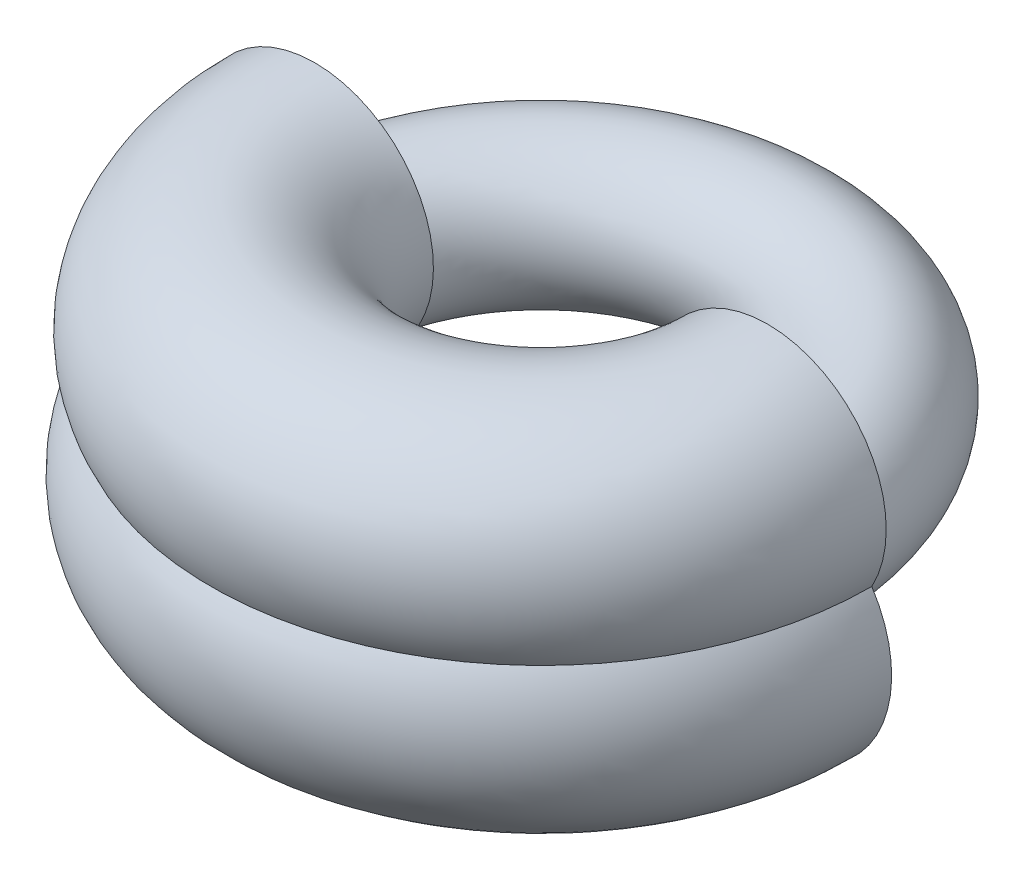
ISO-10303-21;
HEADER;
FILE_DESCRIPTION(('STEP AP214'),'2;1');
FILE_NAME('part.step','',(''),(''),'','','');
FILE_SCHEMA(('AUTOMOTIVE_DESIGN { 1 0 10303 214 1 1 1 1 }'));
ENDSEC;
DATA;
#1=APPLICATION_CONTEXT('core data for automotive mechanical design processes');
#2=APPLICATION_PROTOCOL_DEFINITION('international standard','automotive_design',2000,#1);
#3=PRODUCT_CONTEXT('',#1,'mechanical');
#4=PRODUCT('Part','Part','',(#3));
#5=PRODUCT_RELATED_PRODUCT_CATEGORY('part','',(#4));
#6=PRODUCT_DEFINITION_FORMATION('','',#4);
#7=PRODUCT_DEFINITION_CONTEXT('part definition',#1,'design');
#8=PRODUCT_DEFINITION('design','',#6,#7);
#9=PRODUCT_DEFINITION_SHAPE('','',#8);
#10=(LENGTH_UNIT() NAMED_UNIT(*) SI_UNIT(.MILLI.,.METRE.));
#11=(NAMED_UNIT(*) PLANE_ANGLE_UNIT() SI_UNIT($,.RADIAN.));
#12=(NAMED_UNIT(*) SI_UNIT($,.STERADIAN.) SOLID_ANGLE_UNIT());
#13=UNCERTAINTY_MEASURE_WITH_UNIT(LENGTH_MEASURE(1.E-05),#10,'distance_accuracy_value','');
#14=(GEOMETRIC_REPRESENTATION_CONTEXT(3) GLOBAL_UNCERTAINTY_ASSIGNED_CONTEXT((#13)) GLOBAL_UNIT_ASSIGNED_CONTEXT((#10,
#11,#12)) REPRESENTATION_CONTEXT('',''));
#15=CARTESIAN_POINT('',(0.,0.,0.));
#16=DIRECTION('',(0.,0.,1.));
#17=DIRECTION('',(1.,0.,0.));
#18=AXIS2_PLACEMENT_3D('',#15,#16,#17);
#19=CARTESIAN_POINT('',(0.,29.034348048603,0.));
#20=DIRECTION('',(0.,1.,0.));
#21=DIRECTION('',(0.,0.,1.));
#22=AXIS2_PLACEMENT_3D('',#19,#20,#21);
#23=TOROIDAL_SURFACE('',#22,23.7825711692689,12.4486926690953);
#24=CARTESIAN_POINT('',(0.,23.0828795413032,0.));
#25=DIRECTION('',(0.,1.,0.));
#26=DIRECTION('',(0.,0.,1.));
#27=AXIS2_PLACEMENT_3D('',#24,#25,#26);
#28=CIRCLE('',#27,12.8486801977891);
#29=CARTESIAN_POINT('',(-12.8486801977891,23.0828795413032,0.));
#30=VERTEX_POINT('',#29);
#31=CARTESIAN_POINT('',(12.8486801977891,23.0828795413032,0.));
#32=VERTEX_POINT('',#31);
#33=EDGE_CURVE('E41',#30,#32,#28,.T.);
#34=ORIENTED_EDGE('',*,*,#33,.F.);
#35=CARTESIAN_POINT('',(-23.7825711692689,29.034348048603,-1.66072806854422E-13));
#36=DIRECTION('',(0.,0.,-1.));
#37=DIRECTION('',(-1.,0.,0.));
#38=AXIS2_PLACEMENT_3D('',#35,#36,#37);
#39=CIRCLE('',#38,12.4486926690953);
#40=CARTESIAN_POINT('',(-34.7164621407487,23.0828795413032,-2.42423759430157E-13));
#41=VERTEX_POINT('',#40);
#42=EDGE_CURVE('E69',#41,#30,#39,.T.);
#43=ORIENTED_EDGE('',*,*,#42,.F.);
#44=CARTESIAN_POINT('',(0.,23.0828795413032,0.));
#45=DIRECTION('',(0.,1.,0.));
#46=DIRECTION('',(0.,0.,1.));
#47=AXIS2_PLACEMENT_3D('',#44,#45,#46);
#48=CIRCLE('',#47,34.7164621407487);
#49=CARTESIAN_POINT('',(34.7164621407487,23.0828795413032,0.));
#50=VERTEX_POINT('',#49);
#51=EDGE_CURVE('E48',#41,#50,#48,.T.);
#52=ORIENTED_EDGE('',*,*,#51,.T.);
#53=CARTESIAN_POINT('',(23.7825711692689,29.034348048603,0.));
#54=DIRECTION('',(0.,0.,1.));
#55=DIRECTION('',(1.,0.,0.));
#56=AXIS2_PLACEMENT_3D('',#53,#54,#55);
#57=CIRCLE('',#56,12.4486926690953);
#58=EDGE_CURVE('E64',#50,#32,#57,.T.);
#59=ORIENTED_EDGE('',*,*,#58,.T.);
#60=EDGE_LOOP('',(#34,#43,#52,#59));
#61=FACE_BOUND('',#60,.T.);
#62=ADVANCED_FACE('F33',(#61),#23,.T.);
#63=CARTESIAN_POINT('',(0.,16.0148765534997,0.));
#64=DIRECTION('',(0.,1.,0.));
#65=DIRECTION('',(0.,0.,1.));
#66=AXIS2_PLACEMENT_3D('',#63,#64,#65);
#67=TOROIDAL_SURFACE('',#66,23.7825711692689,13.0194714951033);
#68=CARTESIAN_POINT('',(-23.7825711692689,16.0148765534997,-1.66072806854422E-13));
#69=DIRECTION('',(0.,0.,-1.));
#70=DIRECTION('',(-1.,0.,0.));
#71=AXIS2_PLACEMENT_3D('',#68,#69,#70);
#72=CIRCLE('',#71,13.0194714951033);
#73=EDGE_CURVE('E62',#30,#41,#72,.T.);
#74=ORIENTED_EDGE('',*,*,#73,.F.);
#75=ORIENTED_EDGE('',*,*,#33,.T.);
#76=CARTESIAN_POINT('',(23.7825711692689,16.0148765534997,0.));
#77=DIRECTION('',(0.,0.,1.));
#78=DIRECTION('',(1.,0.,0.));
#79=AXIS2_PLACEMENT_3D('',#76,#77,#78);
#80=CIRCLE('',#79,13.0194714951033);
#81=EDGE_CURVE('E60',#32,#50,#80,.T.);
#82=ORIENTED_EDGE('',*,*,#81,.T.);
#83=ORIENTED_EDGE('',*,*,#51,.F.);
#84=EDGE_LOOP('',(#74,#75,#82,#83));
#85=FACE_BOUND('',#84,.T.);
#86=ADVANCED_FACE('F35',(#85),#67,.T.);
#87=CARTESIAN_POINT('',(-23.7825711692689,22.5246123010513,-1.66072806854422E-13));
#88=DIRECTION('',(0.,0.,-1.));
#89=DIRECTION('',(-1.,0.,0.));
#90=AXIS2_PLACEMENT_3D('',#87,#88,#89);
#91=PLANE('',#90);
#92=CARTESIAN_POINT('',(-24.6676754944566,22.9927370912543,1.72253457323067E-13));
#93=DIRECTION('',(0.,0.,1.));
#94=DIRECTION('',(1.,0.,0.));
#95=AXIS2_PLACEMENT_3D('',#92,#93,#94);
#96=CIRCLE('',#95,7.79168692973486);
#97=CARTESIAN_POINT('',(-32.4593624241915,22.9927370912543,2.26662516349621E-13));
#98=VERTEX_POINT('',#97);
#99=EDGE_CURVE('E66',#98,#98,#96,.T.);
#100=ORIENTED_EDGE('',*,*,#99,.T.);
#101=EDGE_LOOP('',(#100));
#102=FACE_BOUND('',#101,.T.);
#103=ORIENTED_EDGE('',*,*,#42,.T.);
#104=ORIENTED_EDGE('',*,*,#73,.T.);
#105=EDGE_LOOP('',(#103,#104));
#106=FACE_BOUND('',#105,.T.);
#107=ADVANCED_FACE('F76',(#102,#106),#91,.T.);
#108=CARTESIAN_POINT('',(23.7825711692689,22.5246123010513,0.));
#109=DIRECTION('',(0.,0.,1.));
#110=DIRECTION('',(1.,0.,0.));
#111=AXIS2_PLACEMENT_3D('',#108,#109,#110);
#112=PLANE('',#111);
#113=CARTESIAN_POINT('',(24.6676754944566,22.9927370912543,0.));
#114=DIRECTION('',(0.,0.,1.));
#115=DIRECTION('',(1.,0.,0.));
#116=AXIS2_PLACEMENT_3D('',#113,#114,#115);
#117=CIRCLE('',#116,7.79168692973486);
#118=CARTESIAN_POINT('',(32.4593624241915,22.9927370912543,0.));
#119=VERTEX_POINT('',#118);
#120=EDGE_CURVE('E11',#119,#119,#117,.F.);
#121=ORIENTED_EDGE('',*,*,#120,.F.);
#122=EDGE_LOOP('',(#121));
#123=FACE_BOUND('',#122,.T.);
#124=ORIENTED_EDGE('',*,*,#58,.F.);
#125=ORIENTED_EDGE('',*,*,#81,.F.);
#126=EDGE_LOOP('',(#124,#125));
#127=FACE_BOUND('',#126,.T.);
#128=ADVANCED_FACE('F68',(#123,#127),#112,.F.);
#129=CARTESIAN_POINT('',(0.,22.9927370912543,0.));
#130=DIRECTION('',(0.,-1.,0.));
#131=DIRECTION('',(0.,0.,-1.));
#132=AXIS2_PLACEMENT_3D('',#129,#130,#131);
#133=TOROIDAL_SURFACE('',#132,24.6676754944566,7.79168692973486);
#134=CARTESIAN_POINT('',(0.,22.9927370912543,0.));
#135=DIRECTION('',(0.,-1.,0.));
#136=DIRECTION('',(0.,0.,-1.));
#137=AXIS2_PLACEMENT_3D('',#134,#135,#136);
#138=CIRCLE('',#137,32.4593624241915);
#139=EDGE_CURVE('',#98,#119,#138,.T.);
#140=ORIENTED_EDGE('',*,*,#99,.F.);
#141=ORIENTED_EDGE('',*,*,#120,.T.);
#142=ORIENTED_EDGE('',*,*,#139,.T.);
#143=ORIENTED_EDGE('',*,*,#139,.F.);
#144=EDGE_LOOP('',(#140,#142,#141,#143));
#145=FACE_BOUND('',#144,.T.);
#146=ADVANCED_FACE('F84',(#145),#133,.T.);
#147=CLOSED_SHELL('',(#62,#86,#107,#128,#146));
#148=MANIFOLD_SOLID_BREP('B2',#147);
#149=ADVANCED_BREP_SHAPE_REPRESENTATION('',(#18,#148),#14);
#150=SHAPE_DEFINITION_REPRESENTATION(#9,#149);
ENDSEC;
END-ISO-10303-21;
